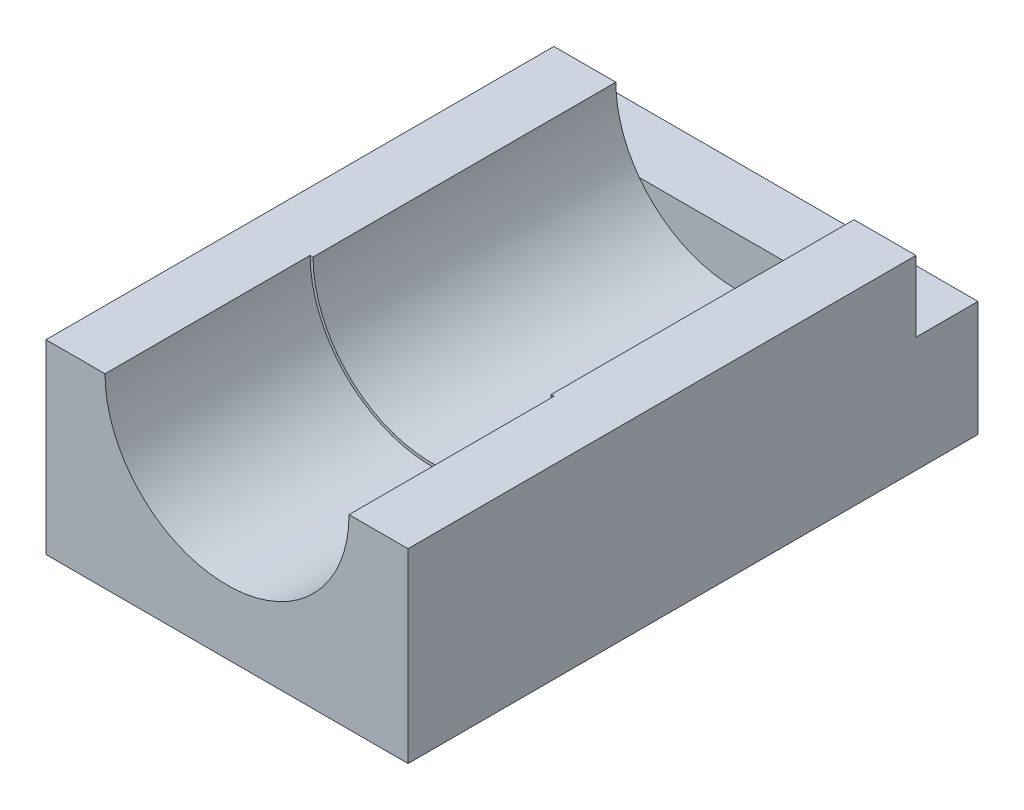
ISO-10303-21;
HEADER;
FILE_DESCRIPTION(('STEP AP214'),'2;1');
FILE_NAME('part.step','',(''),(''),'','','');
FILE_SCHEMA(('AUTOMOTIVE_DESIGN { 1 0 10303 214 1 1 1 1 }'));
ENDSEC;
DATA;
#1=APPLICATION_CONTEXT('core data for automotive mechanical design processes');
#2=APPLICATION_PROTOCOL_DEFINITION('international standard','automotive_design',2000,#1);
#3=PRODUCT_CONTEXT('',#1,'mechanical');
#4=PRODUCT('Part','Part','',(#3));
#5=PRODUCT_RELATED_PRODUCT_CATEGORY('part','',(#4));
#6=PRODUCT_DEFINITION_FORMATION('','',#4);
#7=PRODUCT_DEFINITION_CONTEXT('part definition',#1,'design');
#8=PRODUCT_DEFINITION('design','',#6,#7);
#9=PRODUCT_DEFINITION_SHAPE('','',#8);
#10=(LENGTH_UNIT() NAMED_UNIT(*) SI_UNIT(.MILLI.,.METRE.));
#11=(NAMED_UNIT(*) PLANE_ANGLE_UNIT() SI_UNIT($,.RADIAN.));
#12=(NAMED_UNIT(*) SI_UNIT($,.STERADIAN.) SOLID_ANGLE_UNIT());
#13=UNCERTAINTY_MEASURE_WITH_UNIT(LENGTH_MEASURE(1.E-05),#10,'distance_accuracy_value','');
#14=(GEOMETRIC_REPRESENTATION_CONTEXT(3) GLOBAL_UNCERTAINTY_ASSIGNED_CONTEXT((#13)) GLOBAL_UNIT_ASSIGNED_CONTEXT((#10,
#11,#12)) REPRESENTATION_CONTEXT('',''));
#15=CARTESIAN_POINT('',(0.,0.,0.));
#16=DIRECTION('',(0.,0.,1.));
#17=DIRECTION('',(1.,0.,0.));
#18=AXIS2_PLACEMENT_3D('',#15,#16,#17);
#19=CARTESIAN_POINT('',(5.23144906663831,19.05,0.));
#20=DIRECTION('',(0.,0.,-1.));
#21=DIRECTION('',(-1.,0.,0.));
#22=AXIS2_PLACEMENT_3D('',#19,#20,#21);
#23=PLANE('',#22);
#24=DIRECTION('',(1.,0.,0.));
#25=VECTOR('',#24,1.);
#26=CARTESIAN_POINT('',(-13.3009491249641,11.8004292233212,0.));
#27=LINE('',#26,#25);
#28=CARTESIAN_POINT('',(-13.3009491249641,11.8004292233212,0.));
#29=VERTEX_POINT('',#28);
#30=CARTESIAN_POINT('',(-4.56903722768489,11.8004292233212,0.));
#31=VERTEX_POINT('',#30);
#32=EDGE_CURVE('E47',#29,#31,#27,.T.);
#33=ORIENTED_EDGE('',*,*,#32,.F.);
#34=DIRECTION('',(0.,-1.,0.));
#35=VECTOR('',#34,1.);
#36=CARTESIAN_POINT('',(-13.3009491249641,19.05,0.));
#37=LINE('',#36,#35);
#38=CARTESIAN_POINT('',(-13.3009491249641,19.05,0.));
#39=VERTEX_POINT('',#38);
#40=EDGE_CURVE('E196',#39,#29,#37,.T.);
#41=ORIENTED_EDGE('',*,*,#40,.F.);
#42=DIRECTION('',(-1.,0.,0.));
#43=VECTOR('',#42,1.);
#44=CARTESIAN_POINT('',(-13.3009491249641,19.05,0.));
#45=LINE('',#44,#43);
#46=CARTESIAN_POINT('',(-6.95894912420406,19.05,0.));
#47=VERTEX_POINT('',#46);
#48=EDGE_CURVE('E193',#47,#39,#45,.T.);
#49=ORIENTED_EDGE('',*,*,#48,.F.);
#50=CARTESIAN_POINT('',(5.23144906663831,19.05,0.));
#51=DIRECTION('',(0.,0.,-1.));
#52=DIRECTION('',(-1.,0.,0.));
#53=AXIS2_PLACEMENT_3D('',#50,#51,#52);
#54=CIRCLE('',#53,12.1903981908424);
#55=EDGE_CURVE('E59',#31,#47,#54,.T.);
#56=ORIENTED_EDGE('',*,*,#55,.F.);
#57=EDGE_LOOP('',(#33,#41,#49,#56));
#58=FACE_BOUND('',#57,.T.);
#59=ADVANCED_FACE('F37',(#58),#23,.T.);
#60=CARTESIAN_POINT('',(5.23144906663831,19.05,31.));
#61=DIRECTION('',(0.,0.,-1.));
#62=DIRECTION('',(-1.,0.,0.));
#63=AXIS2_PLACEMENT_3D('',#60,#61,#62);
#64=PLANE('',#63);
#65=CARTESIAN_POINT('',(5.23144901202831,19.05,31.));
#66=DIRECTION('',(0.,0.,-1.));
#67=DIRECTION('',(-1.,0.,0.));
#68=AXIS2_PLACEMENT_3D('',#65,#66,#67);
#69=CIRCLE('',#68,12.4903981382124);
#70=CARTESIAN_POINT('',(17.7218471502407,19.05,31.));
#71=VERTEX_POINT('',#70);
#72=CARTESIAN_POINT('',(-7.25894912618406,19.05,31.));
#73=VERTEX_POINT('',#72);
#74=EDGE_CURVE('E159',#71,#73,#69,.T.);
#75=ORIENTED_EDGE('',*,*,#74,.F.);
#76=DIRECTION('',(-1.,0.,0.));
#77=VECTOR('',#76,1.);
#78=CARTESIAN_POINT('',(23.7638472582407,19.05,31.));
#79=LINE('',#78,#77);
#80=CARTESIAN_POINT('',(17.4218472574807,19.05,31.));
#81=VERTEX_POINT('',#80);
#82=EDGE_CURVE('E187',#71,#81,#79,.T.);
#83=ORIENTED_EDGE('',*,*,#82,.T.);
#84=CARTESIAN_POINT('',(5.23144906663831,19.05,31.));
#85=DIRECTION('',(0.,0.,-1.));
#86=DIRECTION('',(-1.,0.,0.));
#87=AXIS2_PLACEMENT_3D('',#84,#85,#86);
#88=CIRCLE('',#87,12.1903981908424);
#89=CARTESIAN_POINT('',(-6.95894912420406,19.05,31.));
#90=VERTEX_POINT('',#89);
#91=EDGE_CURVE('E181',#81,#90,#88,.T.);
#92=ORIENTED_EDGE('',*,*,#91,.T.);
#93=DIRECTION('',(-1.,0.,0.));
#94=VECTOR('',#93,1.);
#95=CARTESIAN_POINT('',(-13.3009491249641,19.05,31.));
#96=LINE('',#95,#94);
#97=EDGE_CURVE('E184',#90,#73,#96,.T.);
#98=ORIENTED_EDGE('',*,*,#97,.T.);
#99=EDGE_LOOP('',(#75,#83,#92,#98));
#100=FACE_BOUND('',#99,.T.);
#101=ADVANCED_FACE('F279',(#100),#64,.F.);
#102=CARTESIAN_POINT('',(5.23144906663831,19.05,31.));
#103=DIRECTION('',(0.,0.,-1.));
#104=DIRECTION('',(-1.,0.,0.));
#105=AXIS2_PLACEMENT_3D('',#102,#103,#104);
#106=CYLINDRICAL_SURFACE('',#105,12.1903981908424);
#107=CARTESIAN_POINT('',(17.4218472574807,19.05,0.));
#108=VERTEX_POINT('',#107);
#109=CARTESIAN_POINT('',(15.0319353609615,11.8004292233212,0.));
#110=VERTEX_POINT('',#109);
#111=EDGE_CURVE('E190',#108,#110,#54,.T.);
#112=ORIENTED_EDGE('',*,*,#111,.T.);
#113=EDGE_CURVE('E194',#110,#31,#54,.T.);
#114=ORIENTED_EDGE('',*,*,#113,.T.);
#115=ORIENTED_EDGE('',*,*,#55,.T.);
#116=DIRECTION('',(0.,0.,-1.));
#117=VECTOR('',#116,1.);
#118=CARTESIAN_POINT('',(-6.95894912420406,19.05,31.));
#119=LINE('',#118,#117);
#120=EDGE_CURVE('E41',#90,#47,#119,.T.);
#121=ORIENTED_EDGE('',*,*,#120,.F.);
#122=ORIENTED_EDGE('',*,*,#91,.F.);
#123=DIRECTION('',(0.,0.,-1.));
#124=VECTOR('',#123,1.);
#125=CARTESIAN_POINT('',(17.4218472574807,19.05,31.));
#126=LINE('',#125,#124);
#127=EDGE_CURVE('E189',#81,#108,#126,.T.);
#128=ORIENTED_EDGE('',*,*,#127,.T.);
#129=EDGE_LOOP('',(#112,#114,#115,#121,#122,#128));
#130=FACE_BOUND('',#129,.T.);
#131=ADVANCED_FACE('F39',(#130),#106,.F.);
#132=CARTESIAN_POINT('',(-13.3009491249641,19.05,31.));
#133=DIRECTION('',(0.,-1.,0.));
#134=DIRECTION('',(0.,0.,-1.));
#135=AXIS2_PLACEMENT_3D('',#132,#133,#134);
#136=PLANE('',#135);
#137=ORIENTED_EDGE('',*,*,#48,.T.);
#138=DIRECTION('',(0.,0.,-1.));
#139=VECTOR('',#138,1.);
#140=CARTESIAN_POINT('',(-13.3009491249641,19.05,31.));
#141=LINE('',#140,#139);
#142=CARTESIAN_POINT('',(-13.3009491249641,19.05,52.));
#143=VERTEX_POINT('',#142);
#144=EDGE_CURVE('E205',#143,#39,#141,.T.);
#145=ORIENTED_EDGE('',*,*,#144,.F.);
#146=DIRECTION('',(-1.,0.,0.));
#147=VECTOR('',#146,1.);
#148=CARTESIAN_POINT('',(-13.3009491249641,19.05,52.));
#149=LINE('',#148,#147);
#150=CARTESIAN_POINT('',(-7.25894912618406,19.05,52.));
#151=VERTEX_POINT('',#150);
#152=EDGE_CURVE('E160',#151,#143,#149,.T.);
#153=ORIENTED_EDGE('',*,*,#152,.F.);
#154=DIRECTION('',(0.,0.,-1.));
#155=VECTOR('',#154,1.);
#156=CARTESIAN_POINT('',(-7.25894912618406,19.05,52.));
#157=LINE('',#156,#155);
#158=EDGE_CURVE('E173',#151,#73,#157,.T.);
#159=ORIENTED_EDGE('',*,*,#158,.T.);
#160=ORIENTED_EDGE('',*,*,#97,.F.);
#161=ORIENTED_EDGE('',*,*,#120,.T.);
#162=EDGE_LOOP('',(#137,#145,#153,#159,#160,#161));
#163=FACE_BOUND('',#162,.T.);
#164=ADVANCED_FACE('F212',(#163),#136,.F.);
#165=CARTESIAN_POINT('',(-13.3009491249641,19.05,31.));
#166=DIRECTION('',(1.,0.,0.));
#167=DIRECTION('',(0.,1.,0.));
#168=AXIS2_PLACEMENT_3D('',#165,#166,#167);
#169=PLANE('',#168);
#170=ORIENTED_EDGE('',*,*,#40,.T.);
#171=DIRECTION('',(0.,0.,1.));
#172=VECTOR('',#171,1.);
#173=CARTESIAN_POINT('',(-13.3009491249641,11.8004292233212,-6.35));
#174=LINE('',#173,#172);
#175=CARTESIAN_POINT('',(-13.3009491249641,11.8004292233212,-6.35));
#176=VERTEX_POINT('',#175);
#177=EDGE_CURVE('E156',#176,#29,#174,.T.);
#178=ORIENTED_EDGE('',*,*,#177,.F.);
#179=DIRECTION('',(0.,1.,0.));
#180=VECTOR('',#179,1.);
#181=CARTESIAN_POINT('',(-13.3009491249641,0.,-6.35));
#182=LINE('',#181,#180);
#183=CARTESIAN_POINT('',(-13.3009491249641,0.,-6.35));
#184=VERTEX_POINT('',#183);
#185=EDGE_CURVE('E141',#184,#176,#182,.T.);
#186=ORIENTED_EDGE('',*,*,#185,.F.);
#187=DIRECTION('',(0.,0.,-1.));
#188=VECTOR('',#187,1.);
#189=CARTESIAN_POINT('',(-13.3009491249641,0.,31.));
#190=LINE('',#189,#188);
#191=CARTESIAN_POINT('',(-13.3009491249641,0.,52.));
#192=VERTEX_POINT('',#191);
#193=EDGE_CURVE('E133',#192,#184,#190,.T.);
#194=ORIENTED_EDGE('',*,*,#193,.F.);
#195=DIRECTION('',(0.,-1.,0.));
#196=VECTOR('',#195,1.);
#197=CARTESIAN_POINT('',(-13.3009491249641,19.05,52.));
#198=LINE('',#197,#196);
#199=EDGE_CURVE('E163',#143,#192,#198,.T.);
#200=ORIENTED_EDGE('',*,*,#199,.F.);
#201=ORIENTED_EDGE('',*,*,#144,.T.);
#202=EDGE_LOOP('',(#170,#178,#186,#194,#200,#201));
#203=FACE_BOUND('',#202,.T.);
#204=ADVANCED_FACE('F218',(#203),#169,.F.);
#205=CARTESIAN_POINT('',(-13.3009491249641,0.,31.));
#206=DIRECTION('',(0.,1.,0.));
#207=DIRECTION('',(0.,0.,1.));
#208=AXIS2_PLACEMENT_3D('',#205,#206,#207);
#209=PLANE('',#208);
#210=CARTESIAN_POINT('',(-6.95094912496406,0.,0.));
#211=DIRECTION('',(0.,-1.,0.));
#212=DIRECTION('',(0.,0.,-1.));
#213=AXIS2_PLACEMENT_3D('',#210,#211,#212);
#214=CIRCLE('',#213,2.000000064);
#215=CARTESIAN_POINT('',(-6.95094912496406,0.,-2.000000064));
#216=VERTEX_POINT('',#215);
#217=EDGE_CURVE('E238',#216,#216,#214,.T.);
#218=ORIENTED_EDGE('',*,*,#217,.F.);
#219=EDGE_LOOP('',(#218));
#220=FACE_BOUND('',#219,.T.);
#221=CARTESIAN_POINT('',(17.4138472582407,0.,45.65));
#222=DIRECTION('',(0.,-1.,0.));
#223=DIRECTION('',(0.,0.,-1.));
#224=AXIS2_PLACEMENT_3D('',#221,#222,#223);
#225=CIRCLE('',#224,2.000000064);
#226=CARTESIAN_POINT('',(17.4138472582407,0.,43.649999936));
#227=VERTEX_POINT('',#226);
#228=EDGE_CURVE('E243',#227,#227,#225,.T.);
#229=ORIENTED_EDGE('',*,*,#228,.F.);
#230=EDGE_LOOP('',(#229));
#231=FACE_BOUND('',#230,.T.);
#232=CARTESIAN_POINT('',(17.4138472582407,0.,0.));
#233=DIRECTION('',(0.,-1.,0.));
#234=DIRECTION('',(0.,0.,-1.));
#235=AXIS2_PLACEMENT_3D('',#232,#233,#234);
#236=CIRCLE('',#235,2.000000064);
#237=CARTESIAN_POINT('',(17.4138472582407,0.,-2.000000064));
#238=VERTEX_POINT('',#237);
#239=EDGE_CURVE('E244',#238,#238,#236,.T.);
#240=ORIENTED_EDGE('',*,*,#239,.F.);
#241=EDGE_LOOP('',(#240));
#242=FACE_BOUND('',#241,.T.);
#243=CARTESIAN_POINT('',(-6.95094912496406,0.,45.65));
#244=DIRECTION('',(0.,-1.,0.));
#245=DIRECTION('',(0.,0.,-1.));
#246=AXIS2_PLACEMENT_3D('',#243,#244,#245);
#247=CIRCLE('',#246,2.000000064);
#248=CARTESIAN_POINT('',(-6.95094912496406,0.,43.649999936));
#249=VERTEX_POINT('',#248);
#250=EDGE_CURVE('E149',#249,#249,#247,.T.);
#251=ORIENTED_EDGE('',*,*,#250,.F.);
#252=EDGE_LOOP('',(#251));
#253=FACE_BOUND('',#252,.T.);
#254=ORIENTED_EDGE('',*,*,#193,.T.);
#255=DIRECTION('',(-1.,0.,0.));
#256=VECTOR('',#255,1.);
#257=CARTESIAN_POINT('',(23.7638472582407,0.,-6.35));
#258=LINE('',#257,#256);
#259=CARTESIAN_POINT('',(23.7638472582407,0.,-6.35));
#260=VERTEX_POINT('',#259);
#261=EDGE_CURVE('E137',#260,#184,#258,.T.);
#262=ORIENTED_EDGE('',*,*,#261,.F.);
#263=DIRECTION('',(0.,0.,-1.));
#264=VECTOR('',#263,1.);
#265=CARTESIAN_POINT('',(23.7638472582407,0.,31.));
#266=LINE('',#265,#264);
#267=CARTESIAN_POINT('',(23.7638472582407,0.,52.));
#268=VERTEX_POINT('',#267);
#269=EDGE_CURVE('E122',#268,#260,#266,.T.);
#270=ORIENTED_EDGE('',*,*,#269,.F.);
#271=DIRECTION('',(1.,0.,0.));
#272=VECTOR('',#271,1.);
#273=CARTESIAN_POINT('',(-13.3009491249641,0.,52.));
#274=LINE('',#273,#272);
#275=EDGE_CURVE('E166',#192,#268,#274,.T.);
#276=ORIENTED_EDGE('',*,*,#275,.F.);
#277=EDGE_LOOP('',(#254,#262,#270,#276));
#278=FACE_BOUND('',#277,.T.);
#279=ADVANCED_FACE('F138',(#220,#231,#242,#253,#278),#209,.F.);
#280=CARTESIAN_POINT('',(23.7638472582407,19.05,31.));
#281=DIRECTION('',(-1.,0.,0.));
#282=DIRECTION('',(0.,0.,1.));
#283=AXIS2_PLACEMENT_3D('',#280,#281,#282);
#284=PLANE('',#283);
#285=ORIENTED_EDGE('',*,*,#269,.T.);
#286=DIRECTION('',(0.,-1.,0.));
#287=VECTOR('',#286,1.);
#288=CARTESIAN_POINT('',(23.7638472582407,11.8004292233212,-6.35));
#289=LINE('',#288,#287);
#290=CARTESIAN_POINT('',(23.7638472582407,11.8004292233212,-6.35));
#291=VERTEX_POINT('',#290);
#292=EDGE_CURVE('E127',#291,#260,#289,.T.);
#293=ORIENTED_EDGE('',*,*,#292,.F.);
#294=DIRECTION('',(0.,0.,1.));
#295=VECTOR('',#294,1.);
#296=CARTESIAN_POINT('',(23.7638472582407,11.8004292233212,-6.35));
#297=LINE('',#296,#295);
#298=CARTESIAN_POINT('',(23.7638472582407,11.8004292233212,0.));
#299=VERTEX_POINT('',#298);
#300=EDGE_CURVE('E153',#291,#299,#297,.T.);
#301=ORIENTED_EDGE('',*,*,#300,.T.);
#302=DIRECTION('',(0.,1.,0.));
#303=VECTOR('',#302,1.);
#304=CARTESIAN_POINT('',(23.7638472582407,19.05,0.));
#305=LINE('',#304,#303);
#306=CARTESIAN_POINT('',(23.7638472582407,19.05,0.));
#307=VERTEX_POINT('',#306);
#308=EDGE_CURVE('E198',#299,#307,#305,.T.);
#309=ORIENTED_EDGE('',*,*,#308,.T.);
#310=DIRECTION('',(0.,0.,-1.));
#311=VECTOR('',#310,1.);
#312=CARTESIAN_POINT('',(23.7638472582407,19.05,31.));
#313=LINE('',#312,#311);
#314=CARTESIAN_POINT('',(23.7638472582407,19.05,52.));
#315=VERTEX_POINT('',#314);
#316=EDGE_CURVE('E134',#315,#307,#313,.T.);
#317=ORIENTED_EDGE('',*,*,#316,.F.);
#318=DIRECTION('',(0.,1.,0.));
#319=VECTOR('',#318,1.);
#320=CARTESIAN_POINT('',(23.7638472582407,19.05,52.));
#321=LINE('',#320,#319);
#322=EDGE_CURVE('E129',#268,#315,#321,.T.);
#323=ORIENTED_EDGE('',*,*,#322,.F.);
#324=EDGE_LOOP('',(#285,#293,#301,#309,#317,#323));
#325=FACE_BOUND('',#324,.T.);
#326=ADVANCED_FACE('F124',(#325),#284,.F.);
#327=CARTESIAN_POINT('',(23.7638472582407,19.05,31.));
#328=DIRECTION('',(0.,-1.,0.));
#329=DIRECTION('',(0.,0.,-1.));
#330=AXIS2_PLACEMENT_3D('',#327,#328,#329);
#331=PLANE('',#330);
#332=DIRECTION('',(-1.,0.,0.));
#333=VECTOR('',#332,1.);
#334=CARTESIAN_POINT('',(23.7638472582407,19.05,0.));
#335=LINE('',#334,#333);
#336=EDGE_CURVE('E185',#307,#108,#335,.T.);
#337=ORIENTED_EDGE('',*,*,#336,.T.);
#338=ORIENTED_EDGE('',*,*,#127,.F.);
#339=ORIENTED_EDGE('',*,*,#82,.F.);
#340=DIRECTION('',(0.,0.,-1.));
#341=VECTOR('',#340,1.);
#342=CARTESIAN_POINT('',(17.7218471502407,19.05,52.));
#343=LINE('',#342,#341);
#344=CARTESIAN_POINT('',(17.7218471502407,19.05,52.));
#345=VERTEX_POINT('',#344);
#346=EDGE_CURVE('E178',#345,#71,#343,.T.);
#347=ORIENTED_EDGE('',*,*,#346,.F.);
#348=DIRECTION('',(-1.,0.,0.));
#349=VECTOR('',#348,1.);
#350=CARTESIAN_POINT('',(17.7218471502407,19.05,52.));
#351=LINE('',#350,#349);
#352=EDGE_CURVE('E169',#315,#345,#351,.T.);
#353=ORIENTED_EDGE('',*,*,#352,.F.);
#354=ORIENTED_EDGE('',*,*,#316,.T.);
#355=EDGE_LOOP('',(#337,#338,#339,#347,#353,#354));
#356=FACE_BOUND('',#355,.T.);
#357=ADVANCED_FACE('F226',(#356),#331,.F.);
#358=EDGE_CURVE('E11',#110,#299,#27,.T.);
#359=ORIENTED_EDGE('',*,*,#358,.F.);
#360=ORIENTED_EDGE('',*,*,#111,.F.);
#361=ORIENTED_EDGE('',*,*,#336,.F.);
#362=ORIENTED_EDGE('',*,*,#308,.F.);
#363=EDGE_LOOP('',(#359,#360,#361,#362));
#364=FACE_BOUND('',#363,.T.);
#365=ADVANCED_FACE('F230',(#364),#23,.T.);
#366=CARTESIAN_POINT('',(5.23144901202831,19.05,52.));
#367=DIRECTION('',(0.,0.,-1.));
#368=DIRECTION('',(-1.,0.,0.));
#369=AXIS2_PLACEMENT_3D('',#366,#367,#368);
#370=CYLINDRICAL_SURFACE('',#369,12.4903981382124);
#371=ORIENTED_EDGE('',*,*,#74,.T.);
#372=ORIENTED_EDGE('',*,*,#158,.F.);
#373=CARTESIAN_POINT('',(5.23144901202831,19.05,52.));
#374=DIRECTION('',(0.,0.,-1.));
#375=DIRECTION('',(-1.,0.,0.));
#376=AXIS2_PLACEMENT_3D('',#373,#374,#375);
#377=CIRCLE('',#376,12.4903981382124);
#378=EDGE_CURVE('E171',#345,#151,#377,.T.);
#379=ORIENTED_EDGE('',*,*,#378,.F.);
#380=ORIENTED_EDGE('',*,*,#346,.T.);
#381=EDGE_LOOP('',(#371,#372,#379,#380));
#382=FACE_BOUND('',#381,.T.);
#383=ADVANCED_FACE('F288',(#382),#370,.F.);
#384=CARTESIAN_POINT('',(5.23144901202831,19.05,52.));
#385=DIRECTION('',(0.,0.,-1.));
#386=DIRECTION('',(-1.,0.,0.));
#387=AXIS2_PLACEMENT_3D('',#384,#385,#386);
#388=PLANE('',#387);
#389=ORIENTED_EDGE('',*,*,#152,.T.);
#390=ORIENTED_EDGE('',*,*,#199,.T.);
#391=ORIENTED_EDGE('',*,*,#275,.T.);
#392=ORIENTED_EDGE('',*,*,#322,.T.);
#393=ORIENTED_EDGE('',*,*,#352,.T.);
#394=ORIENTED_EDGE('',*,*,#378,.T.);
#395=EDGE_LOOP('',(#389,#390,#391,#392,#393,#394));
#396=FACE_BOUND('',#395,.T.);
#397=ADVANCED_FACE('F293',(#396),#388,.F.);
#398=CARTESIAN_POINT('',(-13.3009491249641,11.8004292233212,-6.35));
#399=DIRECTION('',(0.,-1.,0.));
#400=DIRECTION('',(1.,0.,0.));
#401=AXIS2_PLACEMENT_3D('',#398,#399,#400);
#402=PLANE('',#401);
#403=ORIENTED_EDGE('',*,*,#32,.T.);
#404=EDGE_CURVE('E48',#31,#110,#27,.T.);
#405=ORIENTED_EDGE('',*,*,#404,.T.);
#406=ORIENTED_EDGE('',*,*,#358,.T.);
#407=ORIENTED_EDGE('',*,*,#300,.F.);
#408=DIRECTION('',(1.,0.,0.));
#409=VECTOR('',#408,1.);
#410=CARTESIAN_POINT('',(-13.3009491249641,11.8004292233212,-6.35));
#411=LINE('',#410,#409);
#412=EDGE_CURVE('E145',#176,#291,#411,.T.);
#413=ORIENTED_EDGE('',*,*,#412,.F.);
#414=ORIENTED_EDGE('',*,*,#177,.T.);
#415=EDGE_LOOP('',(#403,#405,#406,#407,#413,#414));
#416=FACE_BOUND('',#415,.T.);
#417=ADVANCED_FACE('F220',(#416),#402,.F.);
#418=CARTESIAN_POINT('',(0.,0.,-6.35));
#419=DIRECTION('',(0.,0.,-1.));
#420=DIRECTION('',(-1.,0.,0.));
#421=AXIS2_PLACEMENT_3D('',#418,#419,#420);
#422=PLANE('',#421);
#423=ORIENTED_EDGE('',*,*,#292,.T.);
#424=ORIENTED_EDGE('',*,*,#261,.T.);
#425=ORIENTED_EDGE('',*,*,#185,.T.);
#426=ORIENTED_EDGE('',*,*,#412,.T.);
#427=EDGE_LOOP('',(#423,#424,#425,#426));
#428=FACE_BOUND('',#427,.T.);
#429=ADVANCED_FACE('F143',(#428),#422,.T.);
#430=CARTESIAN_POINT('',(0.,0.,0.));
#431=DIRECTION('',(0.,0.,-1.));
#432=DIRECTION('',(-1.,0.,0.));
#433=AXIS2_PLACEMENT_3D('',#430,#431,#432);
#434=PLANE('',#433);
#435=ORIENTED_EDGE('',*,*,#113,.F.);
#436=ORIENTED_EDGE('',*,*,#404,.F.);
#437=EDGE_LOOP('',(#435,#436));
#438=FACE_BOUND('',#437,.T.);
#439=ADVANCED_FACE('F232',(#438),#434,.F.);
#440=CARTESIAN_POINT('',(-6.95094912496406,6.99999997,45.65));
#441=DIRECTION('',(0.,-1.,0.));
#442=DIRECTION('',(0.,0.,-1.));
#443=AXIS2_PLACEMENT_3D('',#440,#441,#442);
#444=CYLINDRICAL_SURFACE('',#443,2.000000064);
#445=CARTESIAN_POINT('',(-6.95094912496406,6.99999997,45.65));
#446=DIRECTION('',(0.,-1.,0.));
#447=DIRECTION('',(0.,0.,-1.));
#448=AXIS2_PLACEMENT_3D('',#445,#446,#447);
#449=CIRCLE('',#448,2.000000064);
#450=CARTESIAN_POINT('',(-6.95094912496406,6.99999997,43.649999936));
#451=VERTEX_POINT('',#450);
#452=EDGE_CURVE('E233',#451,#451,#449,.T.);
#453=ORIENTED_EDGE('',*,*,#452,.F.);
#454=EDGE_LOOP('',(#453));
#455=FACE_BOUND('',#454,.T.);
#456=ORIENTED_EDGE('',*,*,#250,.T.);
#457=EDGE_LOOP('',(#456));
#458=FACE_BOUND('',#457,.T.);
#459=ADVANCED_FACE('F266',(#455,#458),#444,.F.);
#460=CARTESIAN_POINT('',(-6.95094912496406,6.99999997,45.65));
#461=DIRECTION('',(0.,-1.,0.));
#462=DIRECTION('',(0.,0.,-1.));
#463=AXIS2_PLACEMENT_3D('',#460,#461,#462);
#464=PLANE('',#463);
#465=ORIENTED_EDGE('',*,*,#452,.T.);
#466=EDGE_LOOP('',(#465));
#467=FACE_BOUND('',#466,.T.);
#468=ADVANCED_FACE('F268',(#467),#464,.T.);
#469=CARTESIAN_POINT('',(17.4138472582407,6.99999997,0.));
#470=DIRECTION('',(0.,-1.,0.));
#471=DIRECTION('',(0.,0.,-1.));
#472=AXIS2_PLACEMENT_3D('',#469,#470,#471);
#473=CYLINDRICAL_SURFACE('',#472,2.000000064);
#474=CARTESIAN_POINT('',(17.4138472582407,6.99999997,0.));
#475=DIRECTION('',(0.,-1.,0.));
#476=DIRECTION('',(0.,0.,-1.));
#477=AXIS2_PLACEMENT_3D('',#474,#475,#476);
#478=CIRCLE('',#477,2.000000064);
#479=CARTESIAN_POINT('',(17.4138472582407,6.99999997,-2.000000064));
#480=VERTEX_POINT('',#479);
#481=EDGE_CURVE('E252',#480,#480,#478,.T.);
#482=ORIENTED_EDGE('',*,*,#481,.F.);
#483=EDGE_LOOP('',(#482));
#484=FACE_BOUND('',#483,.T.);
#485=ORIENTED_EDGE('',*,*,#239,.T.);
#486=EDGE_LOOP('',(#485));
#487=FACE_BOUND('',#486,.T.);
#488=ADVANCED_FACE('F258',(#484,#487),#473,.F.);
#489=CARTESIAN_POINT('',(17.4138472582407,6.99999997,0.));
#490=DIRECTION('',(0.,-1.,0.));
#491=DIRECTION('',(0.,0.,-1.));
#492=AXIS2_PLACEMENT_3D('',#489,#490,#491);
#493=PLANE('',#492);
#494=ORIENTED_EDGE('',*,*,#481,.T.);
#495=EDGE_LOOP('',(#494));
#496=FACE_BOUND('',#495,.T.);
#497=ADVANCED_FACE('F393',(#496),#493,.T.);
#498=CARTESIAN_POINT('',(17.4138472582407,6.99999997,45.65));
#499=DIRECTION('',(0.,-1.,0.));
#500=DIRECTION('',(0.,0.,-1.));
#501=AXIS2_PLACEMENT_3D('',#498,#499,#500);
#502=CYLINDRICAL_SURFACE('',#501,2.000000064);
#503=CARTESIAN_POINT('',(17.4138472582407,6.99999997,45.65));
#504=DIRECTION('',(0.,-1.,0.));
#505=DIRECTION('',(0.,0.,-1.));
#506=AXIS2_PLACEMENT_3D('',#503,#504,#505);
#507=CIRCLE('',#506,2.000000064);
#508=CARTESIAN_POINT('',(17.4138472582407,6.99999997,43.649999936));
#509=VERTEX_POINT('',#508);
#510=EDGE_CURVE('E240',#509,#509,#507,.T.);
#511=ORIENTED_EDGE('',*,*,#510,.F.);
#512=EDGE_LOOP('',(#511));
#513=FACE_BOUND('',#512,.T.);
#514=ORIENTED_EDGE('',*,*,#228,.T.);
#515=EDGE_LOOP('',(#514));
#516=FACE_BOUND('',#515,.T.);
#517=ADVANCED_FACE('F403',(#513,#516),#502,.F.);
#518=CARTESIAN_POINT('',(17.4138472582407,6.99999997,45.65));
#519=DIRECTION('',(0.,-1.,0.));
#520=DIRECTION('',(0.,0.,-1.));
#521=AXIS2_PLACEMENT_3D('',#518,#519,#520);
#522=PLANE('',#521);
#523=ORIENTED_EDGE('',*,*,#510,.T.);
#524=EDGE_LOOP('',(#523));
#525=FACE_BOUND('',#524,.T.);
#526=ADVANCED_FACE('F413',(#525),#522,.T.);
#527=CARTESIAN_POINT('',(-6.95094912496406,6.99999997,0.));
#528=DIRECTION('',(0.,-1.,0.));
#529=DIRECTION('',(0.,0.,-1.));
#530=AXIS2_PLACEMENT_3D('',#527,#528,#529);
#531=CYLINDRICAL_SURFACE('',#530,2.000000064);
#532=CARTESIAN_POINT('',(-6.95094912496406,6.99999997,0.));
#533=DIRECTION('',(0.,-1.,0.));
#534=DIRECTION('',(0.,0.,-1.));
#535=AXIS2_PLACEMENT_3D('',#532,#533,#534);
#536=CIRCLE('',#535,2.000000064);
#537=CARTESIAN_POINT('',(-6.95094912496406,6.99999997,-2.000000064));
#538=VERTEX_POINT('',#537);
#539=EDGE_CURVE('E247',#538,#538,#536,.T.);
#540=ORIENTED_EDGE('',*,*,#539,.F.);
#541=EDGE_LOOP('',(#540));
#542=FACE_BOUND('',#541,.T.);
#543=ORIENTED_EDGE('',*,*,#217,.T.);
#544=EDGE_LOOP('',(#543));
#545=FACE_BOUND('',#544,.T.);
#546=ADVANCED_FACE('F423',(#542,#545),#531,.F.);
#547=CARTESIAN_POINT('',(-6.95094912496406,6.99999997,0.));
#548=DIRECTION('',(0.,-1.,0.));
#549=DIRECTION('',(0.,0.,-1.));
#550=AXIS2_PLACEMENT_3D('',#547,#548,#549);
#551=PLANE('',#550);
#552=ORIENTED_EDGE('',*,*,#539,.T.);
#553=EDGE_LOOP('',(#552));
#554=FACE_BOUND('',#553,.T.);
#555=ADVANCED_FACE('F433',(#554),#551,.T.);
#556=CLOSED_SHELL('',(#59,#101,#131,#164,#204,#279,#326,#357,#365,#383,#397,#417,#429,#439,#459,
#468,#488,#497,#517,#526,#546,#555));
#557=MANIFOLD_SOLID_BREP('B2',#556);
#558=ADVANCED_BREP_SHAPE_REPRESENTATION('',(#18,#557),#14);
#559=SHAPE_DEFINITION_REPRESENTATION(#9,#558);
ENDSEC;
END-ISO-10303-21;
